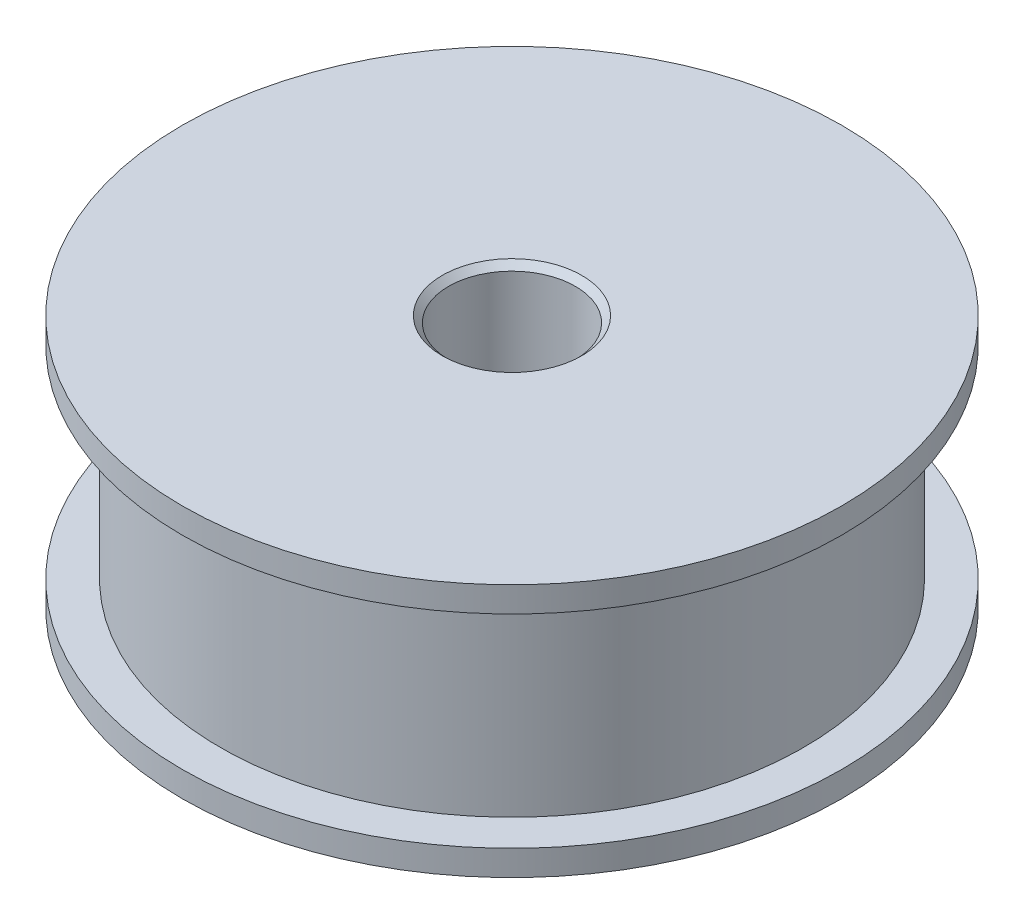
ISO-10303-21;
HEADER;
FILE_DESCRIPTION(('STEP AP214'),'2;1');
FILE_NAME('part.step','',(''),(''),'','','');
FILE_SCHEMA(('AUTOMOTIVE_DESIGN { 1 0 10303 214 1 1 1 1 }'));
ENDSEC;
DATA;
#1=APPLICATION_CONTEXT('core data for automotive mechanical design processes');
#2=APPLICATION_PROTOCOL_DEFINITION('international standard','automotive_design',2000,#1);
#3=PRODUCT_CONTEXT('',#1,'mechanical');
#4=PRODUCT('Part','Part','',(#3));
#5=PRODUCT_RELATED_PRODUCT_CATEGORY('part','',(#4));
#6=PRODUCT_DEFINITION_FORMATION('','',#4);
#7=PRODUCT_DEFINITION_CONTEXT('part definition',#1,'design');
#8=PRODUCT_DEFINITION('design','',#6,#7);
#9=PRODUCT_DEFINITION_SHAPE('','',#8);
#10=(LENGTH_UNIT() NAMED_UNIT(*) SI_UNIT(.MILLI.,.METRE.));
#11=(NAMED_UNIT(*) PLANE_ANGLE_UNIT() SI_UNIT($,.RADIAN.));
#12=(NAMED_UNIT(*) SI_UNIT($,.STERADIAN.) SOLID_ANGLE_UNIT());
#13=UNCERTAINTY_MEASURE_WITH_UNIT(LENGTH_MEASURE(1.E-05),#10,'distance_accuracy_value','');
#14=(GEOMETRIC_REPRESENTATION_CONTEXT(3) GLOBAL_UNCERTAINTY_ASSIGNED_CONTEXT((#13)) GLOBAL_UNIT_ASSIGNED_CONTEXT((#10,
#11,#12)) REPRESENTATION_CONTEXT('',''));
#15=CARTESIAN_POINT('',(0.,0.,0.));
#16=DIRECTION('',(0.,0.,1.));
#17=DIRECTION('',(1.,0.,0.));
#18=AXIS2_PLACEMENT_3D('',#15,#16,#17);
#19=CARTESIAN_POINT('',(0.,20.,0.));
#20=DIRECTION('',(0.,-1.,0.));
#21=DIRECTION('',(0.,0.,-1.));
#22=AXIS2_PLACEMENT_3D('',#19,#20,#21);
#23=CYLINDRICAL_SURFACE('',#22,26.);
#24=CARTESIAN_POINT('',(0.,20.,0.));
#25=DIRECTION('',(0.,1.,0.));
#26=DIRECTION('',(0.,0.,1.));
#27=AXIS2_PLACEMENT_3D('',#24,#25,#26);
#28=CIRCLE('',#27,26.);
#29=CARTESIAN_POINT('',(0.,20.,26.));
#30=VERTEX_POINT('',#29);
#31=EDGE_CURVE('E123',#30,#30,#28,.T.);
#32=ORIENTED_EDGE('',*,*,#31,.F.);
#33=EDGE_LOOP('',(#32));
#34=FACE_BOUND('',#33,.T.);
#35=CARTESIAN_POINT('',(0.,18.,0.));
#36=DIRECTION('',(0.,-1.,0.));
#37=DIRECTION('',(0.,0.,-1.));
#38=AXIS2_PLACEMENT_3D('',#35,#36,#37);
#39=CIRCLE('',#38,26.);
#40=CARTESIAN_POINT('',(0.,18.,-26.));
#41=VERTEX_POINT('',#40);
#42=EDGE_CURVE('E126',#41,#41,#39,.T.);
#43=ORIENTED_EDGE('',*,*,#42,.F.);
#44=EDGE_LOOP('',(#43));
#45=FACE_BOUND('',#44,.T.);
#46=ADVANCED_FACE('F32',(#34,#45),#23,.T.);
#47=CARTESIAN_POINT('',(0.,20.,0.));
#48=DIRECTION('',(0.,1.,0.));
#49=DIRECTION('',(0.,0.,1.));
#50=AXIS2_PLACEMENT_3D('',#47,#48,#49);
#51=PLANE('',#50);
#52=CARTESIAN_POINT('',(0.,20.,0.));
#53=DIRECTION('',(0.,1.,0.));
#54=DIRECTION('',(0.,0.,1.));
#55=AXIS2_PLACEMENT_3D('',#52,#53,#54);
#56=CIRCLE('',#55,5.5);
#57=CARTESIAN_POINT('',(0.,20.,5.5));
#58=VERTEX_POINT('',#57);
#59=EDGE_CURVE('E136',#58,#58,#56,.F.);
#60=ORIENTED_EDGE('',*,*,#59,.T.);
#61=EDGE_LOOP('',(#60));
#62=FACE_BOUND('',#61,.T.);
#63=ORIENTED_EDGE('',*,*,#31,.T.);
#64=EDGE_LOOP('',(#63));
#65=FACE_BOUND('',#64,.T.);
#66=ADVANCED_FACE('F91',(#62,#65),#51,.T.);
#67=CARTESIAN_POINT('',(0.,18.,0.));
#68=DIRECTION('',(0.,-1.,0.));
#69=DIRECTION('',(0.,0.,-1.));
#70=AXIS2_PLACEMENT_3D('',#67,#68,#69);
#71=PLANE('',#70);
#72=CARTESIAN_POINT('',(0.,18.,0.));
#73=DIRECTION('',(0.,-1.,0.));
#74=DIRECTION('',(0.,0.,-1.));
#75=AXIS2_PLACEMENT_3D('',#72,#73,#74);
#76=CIRCLE('',#75,23.);
#77=CARTESIAN_POINT('',(0.,18.,-23.));
#78=VERTEX_POINT('',#77);
#79=EDGE_CURVE('E78',#78,#78,#76,.T.);
#80=ORIENTED_EDGE('',*,*,#79,.F.);
#81=EDGE_LOOP('',(#80));
#82=FACE_BOUND('',#81,.T.);
#83=ORIENTED_EDGE('',*,*,#42,.T.);
#84=EDGE_LOOP('',(#83));
#85=FACE_BOUND('',#84,.T.);
#86=ADVANCED_FACE('F87',(#82,#85),#71,.T.);
#87=CARTESIAN_POINT('',(0.,2.,0.));
#88=DIRECTION('',(0.,-1.,0.));
#89=DIRECTION('',(0.,0.,-1.));
#90=AXIS2_PLACEMENT_3D('',#87,#88,#89);
#91=PLANE('',#90);
#92=CARTESIAN_POINT('',(0.,2.,0.));
#93=DIRECTION('',(0.,-1.,0.));
#94=DIRECTION('',(0.,0.,-1.));
#95=AXIS2_PLACEMENT_3D('',#92,#93,#94);
#96=CIRCLE('',#95,23.);
#97=CARTESIAN_POINT('',(0.,2.,-23.));
#98=VERTEX_POINT('',#97);
#99=EDGE_CURVE('E75',#98,#98,#96,.T.);
#100=ORIENTED_EDGE('',*,*,#99,.T.);
#101=EDGE_LOOP('',(#100));
#102=FACE_BOUND('',#101,.T.);
#103=CARTESIAN_POINT('',(0.,2.,0.));
#104=DIRECTION('',(0.,-1.,0.));
#105=DIRECTION('',(0.,0.,-1.));
#106=AXIS2_PLACEMENT_3D('',#103,#104,#105);
#107=CIRCLE('',#106,26.);
#108=CARTESIAN_POINT('',(0.,2.,-26.));
#109=VERTEX_POINT('',#108);
#110=EDGE_CURVE('E129',#109,#109,#107,.T.);
#111=ORIENTED_EDGE('',*,*,#110,.F.);
#112=EDGE_LOOP('',(#111));
#113=FACE_BOUND('',#112,.T.);
#114=ADVANCED_FACE('F85',(#102,#113),#91,.F.);
#115=CARTESIAN_POINT('',(0.,18.,0.));
#116=DIRECTION('',(0.,-1.,0.));
#117=DIRECTION('',(0.,0.,-1.));
#118=AXIS2_PLACEMENT_3D('',#115,#116,#117);
#119=CYLINDRICAL_SURFACE('',#118,23.);
#120=CARTESIAN_POINT('',(-22.9660074893308,10.,-1.25));
#121=CARTESIAN_POINT('',(-22.9660079453606,9.92984260213779,-1.24999690659648));
#122=CARTESIAN_POINT('',(-22.9663324243369,9.85963565352091,-1.24407368609874));
#123=CARTESIAN_POINT('',(-22.9675954835278,9.72115911093575,-1.22052911955191));
#124=CARTESIAN_POINT('',(-22.9685347844573,9.65289188889691,-1.20289404411814));
#125=CARTESIAN_POINT('',(-22.9709207772096,9.52032077279245,-1.15643270322412));
#126=CARTESIAN_POINT('',(-22.9723672073814,9.45601485498724,-1.12761220801134));
#127=CARTESIAN_POINT('',(-22.9756041458955,9.3331707586771,-1.05960715037706));
#128=CARTESIAN_POINT('',(-22.9773945737778,9.27463123626152,-1.02042501071159));
#129=CARTESIAN_POINT('',(-22.9811201494395,9.16489589355782,-0.932758141494056));
#130=CARTESIAN_POINT('',(-22.9830554440578,9.11370768227925,-0.884263892979946));
#131=CARTESIAN_POINT('',(-22.9868513077095,9.02019297363881,-0.779368649991353));
#132=CARTESIAN_POINT('',(-22.9887118736687,8.97786684053447,-0.722967330671981));
#133=CARTESIAN_POINT('',(-22.992149803825,8.90325595402981,-0.603818028743896));
#134=CARTESIAN_POINT('',(-22.9937269969766,8.87097725676605,-0.541066248442891));
#135=CARTESIAN_POINT('',(-22.9964189488986,8.81741634900081,-0.411024019410908));
#136=CARTESIAN_POINT('',(-22.997533711636,8.79613404416302,-0.343733609621709));
#137=CARTESIAN_POINT('',(-22.9991741919775,8.7651905027374,-0.206595418670422));
#138=CARTESIAN_POINT('',(-22.9997004961332,8.75551769356775,-0.136750255845672));
#139=CARTESIAN_POINT('',(-23.0001067224728,8.74803199671517,0.00357424030690722));
#140=CARTESIAN_POINT('',(-22.9999866504534,8.75021900267433,0.0740535679419363));
#141=CARTESIAN_POINT('',(-22.9991141472226,8.76638127157377,0.213567376171648));
#142=CARTESIAN_POINT('',(-22.9983623840519,8.78034408115449,0.282603304207858));
#143=CARTESIAN_POINT('',(-22.9963119316265,8.81964229290426,0.41734997658801));
#144=CARTESIAN_POINT('',(-22.9950132397736,8.84497774910097,0.483060705133383));
#145=CARTESIAN_POINT('',(-22.9920140475126,8.90631624144904,0.60933175387179));
#146=CARTESIAN_POINT('',(-22.9903133338507,8.94232494184072,0.669889317285532));
#147=CARTESIAN_POINT('',(-22.9867015844678,9.02398363693081,0.784104906644964));
#148=CARTESIAN_POINT('',(-22.9847905469772,9.06963371275882,0.837762874526296));
#149=CARTESIAN_POINT('',(-22.980970399951,9.16934970048167,0.93672876796039));
#150=CARTESIAN_POINT('',(-22.9790612961038,9.22342641821964,0.982025806702068));
#151=CARTESIAN_POINT('',(-22.9754627238249,9.33842272275798,1.06290013491372));
#152=CARTESIAN_POINT('',(-22.97377325546,9.39934231163798,1.09847742142974));
#153=CARTESIAN_POINT('',(-22.9708046690665,9.52630175920577,1.15890144298135));
#154=CARTESIAN_POINT('',(-22.9695255673001,9.5923418206833,1.18374775277411));
#155=CARTESIAN_POINT('',(-22.9675225676117,9.72766454555376,1.22199717511074));
#156=CARTESIAN_POINT('',(-22.9667986647556,9.79694718012432,1.2354003893489));
#157=CARTESIAN_POINT('',(-22.9659886149104,9.93669349471377,1.25036965591079));
#158=CARTESIAN_POINT('',(-22.9659016534157,10.00715555084,1.25195082604034));
#159=CARTESIAN_POINT('',(-22.9663731661879,10.1473439495549,1.24327058785823));
#160=CARTESIAN_POINT('',(-22.9669316379261,10.2170702950249,1.23300922594495));
#161=CARTESIAN_POINT('',(-22.9686303314084,10.353765440421,1.2009477508379));
#162=CARTESIAN_POINT('',(-22.9697702035721,10.4207358712854,1.17915457112368));
#163=CARTESIAN_POINT('',(-22.9725029331748,10.5500684164964,1.12465510739269));
#164=CARTESIAN_POINT('',(-22.9740957937165,10.6124304992749,1.09194874862735));
#165=CARTESIAN_POINT('',(-22.9775569595547,10.7308456345889,1.01651259398106));
#166=CARTESIAN_POINT('',(-22.9794255429724,10.7868922148205,0.973772651212662));
#167=CARTESIAN_POINT('',(-22.9832265808158,10.8910202526659,0.879497364584967));
#168=CARTESIAN_POINT('',(-22.9851590357197,10.9391016506358,0.827961954870319));
#169=CARTESIAN_POINT('',(-22.9888724052319,11.0259853570404,0.717493659996882));
#170=CARTESIAN_POINT('',(-22.9906531590109,11.0647778946488,0.658553083911488));
#171=CARTESIAN_POINT('',(-22.9938601424312,11.1319158866459,0.534986371331544));
#172=CARTESIAN_POINT('',(-22.9952863738243,11.1602613926552,0.470360262932203));
#173=CARTESIAN_POINT('',(-22.9976228177011,11.2056836396831,0.337293193387638));
#174=CARTESIAN_POINT('',(-22.9985333153887,11.2227666098092,0.268854363745749));
#175=CARTESIAN_POINT('',(-22.999736820775,11.2451992569029,0.130074803832834));
#176=CARTESIAN_POINT('',(-23.0000298327934,11.2505490159479,0.0597340868695729));
#177=CARTESIAN_POINT('',(-22.9999653639623,11.2493626028925,-0.0807556483461243));
#178=CARTESIAN_POINT('',(-22.9996087212461,11.2428417453313,-0.150904796827766));
#179=CARTESIAN_POINT('',(-22.9982867340921,11.2181308916567,-0.289110748348517));
#180=CARTESIAN_POINT('',(-22.9973213885299,11.1999408739868,-0.357167547522174));
#181=CARTESIAN_POINT('',(-22.994890569112,11.1524113013111,-0.48925979334759));
#182=CARTESIAN_POINT('',(-22.9934250935967,11.123071709309,-0.553295226654967));
#183=CARTESIAN_POINT('',(-22.9901587383469,11.0540782687811,-0.675532659139827));
#184=CARTESIAN_POINT('',(-22.9883578683921,11.0144247209898,-0.73373482833517));
#185=CARTESIAN_POINT('',(-22.9846206823814,10.9258734054988,-0.842730581287454));
#186=CARTESIAN_POINT('',(-22.9826842091792,10.8769647968725,-0.893515351800763));
#187=CARTESIAN_POINT('',(-22.9788952165331,10.7713019601647,-0.986169913759123));
#188=CARTESIAN_POINT('',(-22.9770427178259,10.7145458080733,-1.02803751253507));
#189=CARTESIAN_POINT('',(-22.9736292020154,10.5947478502463,-1.10169254693167));
#190=CARTESIAN_POINT('',(-22.9720684929555,10.5316995082903,-1.13346935410536));
#191=CARTESIAN_POINT('',(-22.9694193251354,10.4012007726613,-1.18594804801735));
#192=CARTESIAN_POINT('',(-22.9683303103633,10.3337556702281,-1.2066629807425));
#193=CARTESIAN_POINT('',(-22.967034895144,10.2215779755127,-1.23101227835253));
#194=CARTESIAN_POINT('',(-22.9666513243649,10.1775715183028,-1.23812354567172));
#195=CARTESIAN_POINT('',(-22.9661374768474,10.0890500292796,-1.24761838589817));
#196=CARTESIAN_POINT('',(-22.9660071998491,10.0445349979877,-1.25000196365207));
#197=CARTESIAN_POINT('',(-22.9660074893308,10.,-1.25));
#198=B_SPLINE_CURVE_WITH_KNOTS('',3,(#120,#121,#122,#123,#124,#125,#126,#127,#128,#129,#130,
#131,#132,#133,#134,#135,#136,#137,#138,#139,#140,#141,#142,#143,#144,#145,#146,#147,#148,#149,
#150,#151,#152,#153,#154,#155,#156,#157,#158,#159,#160,#161,#162,#163,#164,#165,#166,#167,#168,
#169,#170,#171,#172,#173,#174,#175,#176,#177,#178,#179,#180,#181,#182,#183,#184,#185,#186,#187,
#188,#189,#190,#191,#192,#193,#194,#195,#196,#197),.UNSPECIFIED.,.T.,.F.,(4,2,2,2,2,2,2,2,2,2,2,
2,2,2,2,2,2,2,2,2,2,2,2,2,2,2,2,2,2,2,2,2,2,2,2,2,2,2,4),(0.,0.210309620307611,
0.420866215191582,0.631314333845187,0.841713289035652,1.05232847290504,1.26295231198039,
1.47370286076618,1.68445160152655,1.8949900887061,2.1055266877958,2.3158409152229,
2.5261561417936,2.73658318210961,2.94701199318323,3.15771290106273,3.36841387297679,
3.57912319369837,3.78983064183595,4.00026859512506,4.21070572393285,4.42101647141451,
4.6313286594254,4.84185445780346,5.05238183254567,5.26312969481772,5.4738765157321,
5.68450667833925,5.89513536751978,6.10549251262957,6.31585004633453,6.52620827804694,
6.73656037681859,6.94716041431242,7.15781217722358,7.36868508546785,7.57930874525032,
7.71281067668472,7.84631247125796),.UNSPECIFIED.);
#199=CARTESIAN_POINT('',(-22.9660074893308,10.,-1.25));
#200=VERTEX_POINT('',#199);
#201=EDGE_CURVE('E58',#200,#200,#198,.T.);
#202=ORIENTED_EDGE('',*,*,#201,.F.);
#203=EDGE_LOOP('',(#202));
#204=FACE_BOUND('',#203,.T.);
#205=CARTESIAN_POINT('',(0.,11.25,-23.));
#206=CARTESIAN_POINT('',(0.0701574841489591,11.2499969066748,-22.9999995464798));
#207=CARTESIAN_POINT('',(0.14036451875994,11.2440736721001,-22.9996755589126));
#208=CARTESIAN_POINT('',(0.278841240028029,11.2205290445513,-22.9984142553928));
#209=CARTESIAN_POINT('',(0.347108554823026,11.2028939224852,-22.9974762196496));
#210=CARTESIAN_POINT('',(0.479679867000617,11.1564324451571,-22.9950929726235));
#211=CARTESIAN_POINT('',(0.543985887337104,11.1276118579181,-22.9936480227785));
#212=CARTESIAN_POINT('',(0.666830155204636,11.0596065836167,-22.9904136128434));
#213=CARTESIAN_POINT('',(0.725369746776151,11.0204243195387,-22.9886242333216));
#214=CARTESIAN_POINT('',(0.835105010414245,10.932757325054,-22.984899870737));
#215=CARTESIAN_POINT('',(0.886293095608878,10.8842631034401,-22.9829647403515));
#216=CARTESIAN_POINT('',(0.97980756118481,10.7793679670591,-22.9791682426284));
#217=CARTESIAN_POINT('',(1.02213357692234,10.7229667271048,-22.9773068783285));
#218=CARTESIAN_POINT('',(1.09674434145684,10.6038174937439,-22.9738667342574));
#219=CARTESIAN_POINT('',(1.12902301234937,10.5410656890061,-22.9722881257768));
#220=CARTESIAN_POINT('',(1.18258386460404,10.4110234068369,-22.9695933512824));
#221=CARTESIAN_POINT('',(1.20386614062167,10.343732968479,-22.968477181288));
#222=CARTESIAN_POINT('',(1.2348096206966,10.2065946939993,-22.9668345138149));
#223=CARTESIAN_POINT('',(1.24448239520072,10.1367494757439,-22.9663074292687));
#224=CARTESIAN_POINT('',(1.25196800352087,9.99642487135092,-22.9659006105696));
#225=CARTESIAN_POINT('',(1.24978094406138,9.9259454909257,-22.9660208705914));
#226=CARTESIAN_POINT('',(1.23361859128318,9.78643192085459,-22.9668946339903));
#227=CARTESIAN_POINT('',(1.21965580515618,9.71739627748556,-22.9676474654998));
#228=CARTESIAN_POINT('',(1.18035773931093,9.58265016235849,-22.9697004661491));
#229=CARTESIAN_POINT('',(1.15502240504185,9.5169397065521,-22.9710006379143));
#230=CARTESIAN_POINT('',(1.09368416344329,9.39066898521901,-22.9740025589958));
#231=CARTESIAN_POINT('',(1.05767556314324,9.33011149045237,-22.9757045225233));
#232=CARTESIAN_POINT('',(0.976017080767246,9.21589599577533,-22.9793179911777));
#233=CARTESIAN_POINT('',(0.930367117623371,9.16223805388488,-22.9812294980663));
#234=CARTESIAN_POINT('',(0.830651208817943,9.06327203009183,-22.9850496034949));
#235=CARTESIAN_POINT('',(0.776574434568219,9.0179748578391,-22.9869581950568));
#236=CARTESIAN_POINT('',(0.661577969763035,8.93710028732729,-22.990554978932));
#237=CARTESIAN_POINT('',(0.60065827731693,8.90152289175373,-22.9922431711843));
#238=CARTESIAN_POINT('',(0.473698803858476,8.84109879211702,-22.9952089963558));
#239=CARTESIAN_POINT('',(0.407658836295338,8.81625247924428,-22.9964866143074));
#240=CARTESIAN_POINT('',(0.272336315232593,8.77800302187387,-22.9984870958115));
#241=CARTESIAN_POINT('',(0.203053790397459,8.76459977623868,-22.9992099642671));
#242=CARTESIAN_POINT('',(0.0633075233962715,8.74963039159801,-23.0000188516756));
#243=CARTESIAN_POINT('',(-0.00715459808249182,8.74804916461963,-23.0001056823753));
#244=CARTESIAN_POINT('',(-0.147343141235635,8.75672931243981,-22.9996348652471));
#245=CARTESIAN_POINT('',(-0.217069565791665,8.76699064083487,-22.9990772199444));
#246=CARTESIAN_POINT('',(-0.353765087089874,8.79905212849215,-22.9973807719209));
#247=CARTESIAN_POINT('',(-0.420735806852418,8.82084538786945,-22.9962423167299));
#248=CARTESIAN_POINT('',(-0.550068894520412,8.8753451078977,-22.9935123926938));
#249=CARTESIAN_POINT('',(-0.612431231054715,8.90805164283142,-22.9919209207653));
#250=CARTESIAN_POINT('',(-0.730846533920104,8.98348805373335,-22.9884619056155));
#251=CARTESIAN_POINT('',(-0.786893056508577,9.02622803176853,-22.9865940848609));
#252=CARTESIAN_POINT('',(-0.89102096157748,9.12050335631594,-22.9827936046788));
#253=CARTESIAN_POINT('',(-0.939102284167696,9.17203876895498,-22.9808609447639));
#254=CARTESIAN_POINT('',(-1.02598583528885,9.28250702983649,-22.9771462868055));
#255=CARTESIAN_POINT('',(-1.06477829332785,9.34144756870027,-22.975364448666));
#256=CARTESIAN_POINT('',(-1.13191614555514,9.46501418634015,-22.9721548918586));
#257=CARTESIAN_POINT('',(-1.16026159135892,9.5296402370239,-22.9707271714412));
#258=CARTESIAN_POINT('',(-1.20568379685929,9.66270734918155,-22.9683879965292));
#259=CARTESIAN_POINT('',(-1.22276675962146,9.73114628805607,-22.9674762578852));
#260=CARTESIAN_POINT('',(-1.24519935494727,9.86992607772712,-22.9662710665535));
#261=CARTESIAN_POINT('',(-1.25054907016681,9.94026691512203,-22.9659776095101));
#262=CARTESIAN_POINT('',(-1.24936253251662,10.0807565689938,-22.9660421803842));
#263=CARTESIAN_POINT('',(-1.24284164639967,10.1509055161605,-22.9663993660308));
#264=CARTESIAN_POINT('',(-1.21813080658766,10.2891110581154,-22.9677231856448));
#265=CARTESIAN_POINT('',(-1.19994083097533,10.3571676489734,-22.9686898207569));
#266=CARTESIAN_POINT('',(-1.15241141740243,10.4892594887961,-22.97112340154));
#267=CARTESIAN_POINT('',(-1.1230719426703,10.5532947244974,-22.9725903488609));
#268=CARTESIAN_POINT('',(-1.05407879758938,10.6755318109385,-22.9758591860545));
#269=CARTESIAN_POINT('',(-1.01442542776099,10.7337338315748,-22.9776610661677));
#270=CARTESIAN_POINT('',(-0.925874304386515,10.8427296018331,-22.9813993783095));
#271=CARTESIAN_POINT('',(-0.876965669474564,10.8935145053954,-22.9833359670021));
#272=CARTESIAN_POINT('',(-0.771302725963216,10.9861693234752,-22.9871242361953));
#273=CARTESIAN_POINT('',(-0.714546493642682,11.0280370456667,-22.9889758957282));
#274=CARTESIAN_POINT('',(-0.594748474144662,11.1016922087704,-22.9923871406833));
#275=CARTESIAN_POINT('',(-0.531700165038706,11.1334690445067,-22.993946418122));
#276=CARTESIAN_POINT('',(-0.401201499798104,11.1859478009983,-22.9965927668707));
#277=CARTESIAN_POINT('',(-0.333756434717349,11.2066627672978,-22.9976803941239));
#278=CARTESIAN_POINT('',(-0.221578649753997,11.2310121621726,-22.9989740712893));
#279=CARTESIAN_POINT('',(-0.177572058070253,11.2381234731945,-22.9993570976617));
#280=CARTESIAN_POINT('',(-0.0890502994617616,11.2476183714998,-22.9998702058327));
#281=CARTESIAN_POINT('',(-0.0445351330558323,11.2500019636059,-23.0000002878892));
#282=CARTESIAN_POINT('',(0.,11.25,-23.));
#283=B_SPLINE_CURVE_WITH_KNOTS('',3,(#205,#206,#207,#208,#209,#210,#211,#212,#213,#214,#215,
#216,#217,#218,#219,#220,#221,#222,#223,#224,#225,#226,#227,#228,#229,#230,#231,#232,#233,#234,
#235,#236,#237,#238,#239,#240,#241,#242,#243,#244,#245,#246,#247,#248,#249,#250,#251,#252,#253,
#254,#255,#256,#257,#258,#259,#260,#261,#262,#263,#264,#265,#266,#267,#268,#269,#270,#271,#272,
#273,#274,#275,#276,#277,#278,#279,#280,#281,#282),.UNSPECIFIED.,.T.,.F.,(4,2,2,2,2,2,2,2,2,2,2,
2,2,2,2,2,2,2,2,2,2,2,2,2,2,2,2,2,2,2,2,2,2,2,2,2,2,2,4),(0.,0.21030987945078,0.420866727821662,
0.631315142032036,0.841714388235874,1.05232923309751,1.2629527423354,1.47370341679177,
1.68445227710424,1.89499092264464,2.10552767358922,2.31584109121604,2.52615551766636,
2.73658232537181,2.94701090248965,3.15771214810814,3.36841345194191,3.57912243602345,
3.78982955777188,4.00026771640958,4.21070505047605,4.42101661598779,4.63132961304446,
4.84185527665561,5.05238252313414,5.2631302493966,5.47387693440498,5.68450744875617,
5.89513647929729,6.10549303982835,6.31584999545914,6.52620764486259,6.73655916567091,
6.94715954967004,7.15781165103341,7.36868441340688,7.57930793585165,7.71281027180174,
7.84631247157291),.UNSPECIFIED.);
#284=CARTESIAN_POINT('',(0.,11.25,-23.));
#285=VERTEX_POINT('',#284);
#286=EDGE_CURVE('E57',#285,#285,#283,.T.);
#287=ORIENTED_EDGE('',*,*,#286,.F.);
#288=EDGE_LOOP('',(#287));
#289=FACE_BOUND('',#288,.T.);
#290=ORIENTED_EDGE('',*,*,#79,.T.);
#291=EDGE_LOOP('',(#290));
#292=FACE_BOUND('',#291,.T.);
#293=ORIENTED_EDGE('',*,*,#99,.F.);
#294=EDGE_LOOP('',(#293));
#295=FACE_BOUND('',#294,.T.);
#296=ADVANCED_FACE('F80',(#204,#289,#292,#295),#119,.T.);
#297=CARTESIAN_POINT('',(0.,0.,0.));
#298=DIRECTION('',(0.,1.,0.));
#299=DIRECTION('',(0.,0.,1.));
#300=AXIS2_PLACEMENT_3D('',#297,#298,#299);
#301=PLANE('',#300);
#302=CARTESIAN_POINT('',(0.,0.,0.));
#303=DIRECTION('',(0.,1.,0.));
#304=DIRECTION('',(0.,0.,1.));
#305=AXIS2_PLACEMENT_3D('',#302,#303,#304);
#306=CIRCLE('',#305,5.5);
#307=CARTESIAN_POINT('',(0.,0.,5.5));
#308=VERTEX_POINT('',#307);
#309=EDGE_CURVE('E10',#308,#308,#306,.T.);
#310=ORIENTED_EDGE('',*,*,#309,.T.);
#311=EDGE_LOOP('',(#310));
#312=FACE_BOUND('',#311,.T.);
#313=CARTESIAN_POINT('',(0.,0.,0.));
#314=DIRECTION('',(0.,1.,0.));
#315=DIRECTION('',(0.,0.,1.));
#316=AXIS2_PLACEMENT_3D('',#313,#314,#315);
#317=CIRCLE('',#316,26.);
#318=CARTESIAN_POINT('',(0.,0.,26.));
#319=VERTEX_POINT('',#318);
#320=EDGE_CURVE('E128',#319,#319,#317,.T.);
#321=ORIENTED_EDGE('',*,*,#320,.F.);
#322=EDGE_LOOP('',(#321));
#323=FACE_BOUND('',#322,.T.);
#324=ADVANCED_FACE('F84',(#312,#323),#301,.F.);
#325=ORIENTED_EDGE('',*,*,#110,.T.);
#326=EDGE_LOOP('',(#325));
#327=FACE_BOUND('',#326,.T.);
#328=ORIENTED_EDGE('',*,*,#320,.T.);
#329=EDGE_LOOP('',(#328));
#330=FACE_BOUND('',#329,.T.);
#331=ADVANCED_FACE('F101',(#327,#330),#23,.T.);
#332=CARTESIAN_POINT('',(0.,20.,0.));
#333=DIRECTION('',(0.,-1.,0.));
#334=DIRECTION('',(0.,0.,-1.));
#335=AXIS2_PLACEMENT_3D('',#332,#333,#334);
#336=CYLINDRICAL_SURFACE('',#335,5.);
#337=CARTESIAN_POINT('',(-4.84122918275927,10.,-1.25));
#338=CARTESIAN_POINT('',(-4.84123050042654,9.9309746245377,-1.24999803929589));
#339=CARTESIAN_POINT('',(-4.84272153006957,9.861927550661,-1.24426312274865));
#340=CARTESIAN_POINT('',(-4.84850930996624,9.72581621091298,-1.22151156273207));
#341=CARTESIAN_POINT('',(-4.85280769310907,9.65875312276584,-1.2044883533711));
#342=CARTESIAN_POINT('',(-4.86369362297984,9.52859823090648,-1.15974559981597));
#343=CARTESIAN_POINT('',(-4.87027821345204,9.46550142230716,-1.13203986392723));
#344=CARTESIAN_POINT('',(-4.88499096014404,9.34484457373004,-1.0667605706307));
#345=CARTESIAN_POINT('',(-4.89311918189251,9.28728476895989,-1.02918659428035));
#346=CARTESIAN_POINT('',(-4.91020358177805,9.1780691773689,-0.944354213655937));
#347=CARTESIAN_POINT('',(-4.91917298811515,9.12655319982498,-0.896918443852024));
#348=CARTESIAN_POINT('',(-4.93681437757649,9.03211930281983,-0.794091032050332));
#349=CARTESIAN_POINT('',(-4.94548633283195,8.98920218718913,-0.738698647090153));
#350=CARTESIAN_POINT('',(-4.96170207760291,8.91261226618436,-0.620572600539477));
#351=CARTESIAN_POINT('',(-4.96922843700296,8.87907680591927,-0.557747288097559));
#352=CARTESIAN_POINT('',(-4.98215405962992,8.82309517792346,-0.42713159214638));
#353=CARTESIAN_POINT('',(-4.98755363667172,8.80064737404224,-0.359341942895969));
#354=CARTESIAN_POINT('',(-4.9955237942409,8.76792608271071,-0.22217937937708));
#355=CARTESIAN_POINT('',(-4.99814946922157,8.75741517783671,-0.152866359774487));
#356=CARTESIAN_POINT('',(-5.00046797053649,8.74812081036223,-0.0134144096313845));
#357=CARTESIAN_POINT('',(-5.00016123048352,8.7493356138952,0.0567243972690342));
#358=CARTESIAN_POINT('',(-4.99669047476767,8.76328742512507,0.194190308965484));
#359=CARTESIAN_POINT('',(-4.99359001170437,8.77576816252693,0.261545269501333));
#360=CARTESIAN_POINT('',(-4.98495418262427,8.81148563502425,0.393172809267108));
#361=CARTESIAN_POINT('',(-4.9794186869922,8.83472294268871,0.457445224213047));
#362=CARTESIAN_POINT('',(-4.96643754850448,8.89150128534353,0.581758379377258));
#363=CARTESIAN_POINT('',(-4.95897509847527,8.92513352233087,0.641755637208131));
#364=CARTESIAN_POINT('',(-4.94294951904824,9.00167783955813,0.755344527925611));
#365=CARTESIAN_POINT('',(-4.93438619826245,9.04459153428031,0.808935043856881));
#366=CARTESIAN_POINT('',(-4.9168185688476,9.13985437099119,0.909717543856195));
#367=CARTESIAN_POINT('',(-4.90780859762959,9.19242744617389,0.956697098843999));
#368=CARTESIAN_POINT('',(-4.89057521758353,9.30479998677013,1.04122046995377));
#369=CARTESIAN_POINT('',(-4.88235184552985,9.3645997897455,1.07876384505752));
#370=CARTESIAN_POINT('',(-4.86760248415824,9.49014501707448,1.14348516127825));
#371=CARTESIAN_POINT('',(-4.8610849186286,9.5559178651566,1.17061195871311));
#372=CARTESIAN_POINT('',(-4.85059320069978,9.69129273403823,1.21335702579543));
#373=CARTESIAN_POINT('',(-4.84661850405109,9.76089393199157,1.22897775819114));
#374=CARTESIAN_POINT('',(-4.8417767801957,9.89997975076156,1.24791481933259));
#375=CARTESIAN_POINT('',(-4.84083044546824,9.96941889666481,1.25154523695981));
#376=CARTESIAN_POINT('',(-4.8419367174052,10.1079109682891,1.24725849525777));
#377=CARTESIAN_POINT('',(-4.84398904800633,10.1769639289756,1.2393423989244));
#378=CARTESIAN_POINT('',(-4.8507854097728,10.3115571324774,1.21246273196883));
#379=CARTESIAN_POINT('',(-4.85548485117188,10.3771363632854,1.19368203414087));
#380=CARTESIAN_POINT('',(-4.86700359135481,10.5042157289258,1.14580904083531));
#381=CARTESIAN_POINT('',(-4.87382314124307,10.5657153795277,1.11671552385627));
#382=CARTESIAN_POINT('',(-4.88898068546631,10.6842206389337,1.04838533396828));
#383=CARTESIAN_POINT('',(-4.89734584303321,10.7411144200216,1.00896087691781));
#384=CARTESIAN_POINT('',(-4.91458541535858,10.8475941814007,0.92132536616807));
#385=CARTESIAN_POINT('',(-4.92345991364235,10.897178958325,0.873112868506799));
#386=CARTESIAN_POINT('',(-4.94098701515803,10.9889055212855,0.767828401230907));
#387=CARTESIAN_POINT('',(-4.94962851030918,11.0308300312744,0.710564940664491));
#388=CARTESIAN_POINT('',(-4.96548608306867,11.1044679334756,0.589628353368345));
#389=CARTESIAN_POINT('',(-4.9727022350198,11.1361818583041,0.525955561196989));
#390=CARTESIAN_POINT('',(-4.98485057869157,11.188223017264,0.394447752163863));
#391=CARTESIAN_POINT('',(-4.98979915011205,11.2086321421895,0.326646726284852));
#392=CARTESIAN_POINT('',(-4.99692646697894,11.2377301673042,0.18843720039851));
#393=CARTESIAN_POINT('',(-4.99910574696704,11.2464213293695,0.118029206301555));
#394=CARTESIAN_POINT('',(-5.00042711761014,11.2517094869694,-0.0213544080541574));
#395=CARTESIAN_POINT('',(-4.9996497360001,11.2486271363692,-0.0903172837075409));
#396=CARTESIAN_POINT('',(-4.99532370571779,11.2311902158821,-0.226709370518424));
#397=CARTESIAN_POINT('',(-4.99177513946369,11.2168359812336,-0.294138627226108));
#398=CARTESIAN_POINT('',(-4.98231791067453,11.1774347252863,-0.42521379455602));
#399=CARTESIAN_POINT('',(-4.97642205628333,11.1524456833567,-0.488878118226273));
#400=CARTESIAN_POINT('',(-4.9628911114173,11.0925367762258,-0.611146316301835));
#401=CARTESIAN_POINT('',(-4.9552558017217,11.057615659163,-0.669749551581314));
#402=CARTESIAN_POINT('',(-4.93884062101666,10.9778559575037,-0.781752410529875));
#403=CARTESIAN_POINT('',(-4.93003771182014,10.9327998213658,-0.834993735375731));
#404=CARTESIAN_POINT('',(-4.91238311316552,10.8344714350328,-0.933268775339069));
#405=CARTESIAN_POINT('',(-4.90353141190695,10.7811971048776,-0.978300406335237));
#406=CARTESIAN_POINT('',(-4.88659344825685,10.6667482322483,-1.05970253309904));
#407=CARTESIAN_POINT('',(-4.87852454662356,10.6054448457342,-1.09589577430819));
#408=CARTESIAN_POINT('',(-4.8642994443827,10.4774306375966,-1.15740862076958));
#409=CARTESIAN_POINT('',(-4.85814185308378,10.4107237923666,-1.18273613719965));
#410=CARTESIAN_POINT('',(-4.84939885924729,10.2867787352166,-1.2180281607068));
#411=CARTESIAN_POINT('',(-4.84635828750683,10.2301335445202,-1.22999146324422));
#412=CARTESIAN_POINT('',(-4.84227298231965,10.11566391375,-1.24597786571659));
#413=CARTESIAN_POINT('',(-4.84122807862454,10.0578395746937,-1.25000164296523));
#414=CARTESIAN_POINT('',(-4.84122918275927,10.,-1.25));
#415=B_SPLINE_CURVE_WITH_KNOTS('',3,(#337,#338,#339,#340,#341,#342,#343,#344,#345,#346,#347,
#348,#349,#350,#351,#352,#353,#354,#355,#356,#357,#358,#359,#360,#361,#362,#363,#364,#365,#366,
#367,#368,#369,#370,#371,#372,#373,#374,#375,#376,#377,#378,#379,#380,#381,#382,#383,#384,#385,
#386,#387,#388,#389,#390,#391,#392,#393,#394,#395,#396,#397,#398,#399,#400,#401,#402,#403,#404,
#405,#406,#407,#408,#409,#410,#411,#412,#413,#414),.UNSPECIFIED.,.T.,.F.,(4,2,2,2,2,2,2,2,2,2,2,
2,2,2,2,2,2,2,2,2,2,2,2,2,2,2,2,2,2,2,2,2,2,2,2,2,2,2,4),(0.,0.206863720868069,
0.413847870714333,0.620565363583013,0.827291633777391,1.03811977096488,1.24896760739933,
1.4627574819896,1.67651579923546,1.88594375497673,2.0953407433301,2.30009131344473,
2.50485278362393,2.71146437127222,2.91811192734457,3.13035233285956,3.34260265599901,
3.55588216004201,3.76911600064774,3.97671787380858,4.18430063591901,4.38848702504603,
4.59269760710709,4.80091422929579,5.00916509442522,5.22262665482659,5.43607707859777,
5.64796036403464,5.85980274454519,6.06591723063728,6.2720255868849,6.47702438279855,
6.68204902869036,6.89198548291035,7.10197515782754,7.31588238642338,7.52963360683309,
7.70298913588664,7.8763298754976),.UNSPECIFIED.);
#416=CARTESIAN_POINT('',(-4.84122918275927,10.,-1.25));
#417=VERTEX_POINT('',#416);
#418=EDGE_CURVE('E36',#417,#417,#415,.T.);
#419=ORIENTED_EDGE('',*,*,#418,.T.);
#420=EDGE_LOOP('',(#419));
#421=FACE_BOUND('',#420,.T.);
#422=CARTESIAN_POINT('',(0.,11.25,-5.));
#423=CARTESIAN_POINT('',(0.0690634072247759,11.2499980618849,-4.99999883223344));
#424=CARTESIAN_POINT('',(0.138148464858969,11.2442570410218,-4.99855481776523));
#425=CARTESIAN_POINT('',(0.274338603142111,11.2214790405775,-4.99293428191577));
#426=CARTESIAN_POINT('',(0.341442539058949,11.2044356587185,-4.98875621183307));
#427=CARTESIAN_POINT('',(0.471684060152147,11.1596339554483,-4.97813021943366));
#428=CARTESIAN_POINT('',(0.534826302858335,11.1318885010706,-4.97168502368405));
#429=CARTESIAN_POINT('',(0.655560109920355,11.066515508296,-4.95721119839661));
#430=CARTESIAN_POINT('',(0.713151486957299,11.0288876365676,-4.94918251545042));
#431=CARTESIAN_POINT('',(0.822334939417433,10.9439993419548,-4.93222844659834));
#432=CARTESIAN_POINT('',(0.873796408384227,10.896573687534,-4.92328922623777));
#433=CARTESIAN_POINT('',(0.968124106002754,10.7937898292426,-4.90561350097941));
#434=CARTESIAN_POINT('',(1.01098936412428,10.7384307308779,-4.89687701906957));
#435=CARTESIAN_POINT('',(1.08752211899919,10.6203373110521,-4.88045646416425));
#436=CARTESIAN_POINT('',(1.12104351327113,10.5575056409913,-4.87278995392171));
#437=CARTESIAN_POINT('',(1.17699742379211,10.426876323618,-4.85957912343519));
#438=CARTESIAN_POINT('',(1.19943171286611,10.3590794722285,-4.85403446393991));
#439=CARTESIAN_POINT('',(1.23212903067024,10.2218804181646,-4.84583730597959));
#440=CARTESIAN_POINT('',(1.24262689027778,10.1525375866252,-4.84312909229521));
#441=CARTESIAN_POINT('',(1.25188481255654,10.0130261924883,-4.84074468781451));
#442=CARTESIAN_POINT('',(1.25064678484831,9.94285776608449,-4.8410680037387));
#443=CARTESIAN_POINT('',(1.2366554371994,9.8054868268796,-4.84466004580515));
#444=CARTESIAN_POINT('',(1.22418195015877,9.73825364877908,-4.84785719168233));
#445=CARTESIAN_POINT('',(1.18852015575259,9.60686579090726,-4.85672258063736));
#446=CARTESIAN_POINT('',(1.16533108505785,9.54271133080918,-4.8623909997558));
#447=CARTESIAN_POINT('',(1.10865789828096,9.41855165312328,-4.87562594920155));
#448=CARTESIAN_POINT('',(1.07507222269409,9.35859485684204,-4.88321106224517));
#449=CARTESIAN_POINT('',(0.998630230012462,9.2450677418693,-4.89941425705322));
#450=CARTESIAN_POINT('',(0.955772290674033,9.19149854327729,-4.90803251945613));
#451=CARTESIAN_POINT('',(0.860552853901014,9.090663653588,-4.92563233783151));
#452=CARTESIAN_POINT('',(0.807955215138215,9.04362125828221,-4.93461724564976));
#453=CARTESIAN_POINT('',(0.695509931253082,8.95898229794675,-4.95171637982321));
#454=CARTESIAN_POINT('',(0.635662064756618,8.92138602144703,-4.95983057957846));
#455=CARTESIAN_POINT('',(0.510096573901158,8.85662451147968,-4.97431443411819));
#456=CARTESIAN_POINT('',(0.444359494340518,8.82949554978798,-4.98067800106437));
#457=CARTESIAN_POINT('',(0.309063340119068,8.78673557857536,-4.99089930826182));
#458=CARTESIAN_POINT('',(0.23950499929207,8.77110236965155,-4.99475752782734));
#459=CARTESIAN_POINT('',(0.100449975325022,8.75211869536763,-4.99946249392812));
#460=CARTESIAN_POINT('',(0.0309972666568408,8.74846414493725,-5.00038377923565));
#461=CARTESIAN_POINT('',(-0.107527395667924,8.75270750171291,-4.99932337345376));
#462=CARTESIAN_POINT('',(-0.176599383037163,8.76060436899928,-4.99734194368205));
#463=CARTESIAN_POINT('',(-0.31134522398041,8.78747575699282,-4.99074650939464));
#464=CARTESIAN_POINT('',(-0.377054265807296,8.80628438623082,-4.98617195154843));
#465=CARTESIAN_POINT('',(-0.50438107704376,8.85425590335704,-4.97490588861778));
#466=CARTESIAN_POINT('',(-0.565998432527196,8.88341983692764,-4.9682141697491));
#467=CARTESIAN_POINT('',(-0.684602612024873,8.95186344072894,-4.95327756605259));
#468=CARTESIAN_POINT('',(-0.741487868196526,8.9913134269973,-4.94500722805777));
#469=CARTESIAN_POINT('',(-0.847938844702705,9.07899159066414,-4.92787090989516));
#470=CARTESIAN_POINT('',(-0.897503299144173,9.12722128301409,-4.91900482709754));
#471=CARTESIAN_POINT('',(-0.989158806727275,9.23250163403705,-4.90140797467309));
#472=CARTESIAN_POINT('',(-1.03103655635169,9.28973975250202,-4.89268586822734));
#473=CARTESIAN_POINT('',(-1.10459229917725,9.41061052872143,-4.87660731981032));
#474=CARTESIAN_POINT('',(-1.13627074513161,9.47424290246646,-4.86925081722522));
#475=CARTESIAN_POINT('',(-1.18829285050774,9.60575476867757,-4.85681745612221));
#476=CARTESIAN_POINT('',(-1.20870366387839,9.67360635695334,-4.85172712743255));
#477=CARTESIAN_POINT('',(-1.23778804996148,9.81192469824093,-4.84438953408486));
#478=CARTESIAN_POINT('',(-1.24646418956555,9.88239087586041,-4.84214164766613));
#479=CARTESIAN_POINT('',(-1.25169882527833,10.0217675198793,-4.8407908433663));
#480=CARTESIAN_POINT('',(-1.2485982481501,10.0906645292706,-4.8415994394022));
#481=CARTESIAN_POINT('',(-1.23114773192739,10.2269199072233,-4.84606590839869));
#482=CARTESIAN_POINT('',(-1.21679801890564,10.294278306678,-4.84972372409881));
#483=CARTESIAN_POINT('',(-1.17744276620233,10.4251737158878,-4.85942717235602));
#484=CARTESIAN_POINT('',(-1.15250117056698,10.4887310877002,-4.86545846030258));
#485=CARTESIAN_POINT('',(-1.09272076133756,10.6108044855947,-4.8792312977069));
#486=CARTESIAN_POINT('',(-1.05788057502849,10.6693198109891,-4.88697308433977));
#487=CARTESIAN_POINT('',(-0.97822312386428,10.7812955241683,-4.90354695219593));
#488=CARTESIAN_POINT('',(-0.933169302426878,10.8345842278533,-4.91240220693131));
#489=CARTESIAN_POINT('',(-0.834824475991445,10.9329558706628,-4.93006689371905));
#490=CARTESIAN_POINT('',(-0.78153151771762,10.9780368584275,-4.93887631439216));
#491=CARTESIAN_POINT('',(-0.667056322252157,11.0595094238038,-4.95564713039719));
#492=CARTESIAN_POINT('',(-0.605748685263654,11.0957288447263,-4.9635902780489));
#493=CARTESIAN_POINT('',(-0.477721716258729,11.1572895524504,-4.97754104145932));
#494=CARTESIAN_POINT('',(-0.411006302863949,11.1826386338738,-4.98355004333151));
#495=CARTESIAN_POINT('',(-0.287008544369559,11.2179765252747,-4.99206716304618));
#496=CARTESIAN_POINT('',(-0.230316809090057,11.2299593692112,-4.99502154210575));
#497=CARTESIAN_POINT('',(-0.115755059613569,11.245971619685,-4.9989883769329));
#498=CARTESIAN_POINT('',(-0.0578851343688467,11.2500016244211,-5.00000097875745));
#499=CARTESIAN_POINT('',(0.,11.25,-5.));
#500=B_SPLINE_CURVE_WITH_KNOTS('',3,(#422,#423,#424,#425,#426,#427,#428,#429,#430,#431,#432,
#433,#434,#435,#436,#437,#438,#439,#440,#441,#442,#443,#444,#445,#446,#447,#448,#449,#450,#451,
#452,#453,#454,#455,#456,#457,#458,#459,#460,#461,#462,#463,#464,#465,#466,#467,#468,#469,#470,
#471,#472,#473,#474,#475,#476,#477,#478,#479,#480,#481,#482,#483,#484,#485,#486,#487,#488,#489,
#490,#491,#492,#493,#494,#495,#496,#497,#498,#499),.UNSPECIFIED.,.T.,.F.,(4,2,2,2,2,2,2,2,2,2,2,
2,2,2,2,2,2,2,2,2,2,2,2,2,2,2,2,2,2,2,2,2,2,2,2,2,2,2,4),(0.,0.206978093726575,
0.414073531469916,0.620920751905088,0.827774950141107,1.03845362864283,1.24915607983385,
1.46298872954839,1.6767871764114,1.88630245916192,2.09578365093914,2.30018747505848,
2.50460586221698,2.71108773228232,2.91760575696802,3.13001250807516,3.34242574631872,
3.55556857507595,3.76867061407202,3.97631924124397,4.18394917593952,4.38850228761698,
4.59307606101909,4.80127989637793,5.00951969173349,5.2228709100373,5.4362126562459,
5.6482687884503,5.8602785271034,6.06619816998844,6.27211367463362,6.47680333799539,
6.68152140114084,6.89157980341591,7.10168808142014,7.3156015458299,7.52936136517791,
7.70285202451791,7.87632963369199),.UNSPECIFIED.);
#501=CARTESIAN_POINT('',(0.,11.25,-5.));
#502=VERTEX_POINT('',#501);
#503=EDGE_CURVE('E52',#502,#502,#500,.T.);
#504=ORIENTED_EDGE('',*,*,#503,.T.);
#505=EDGE_LOOP('',(#504));
#506=FACE_BOUND('',#505,.T.);
#507=CARTESIAN_POINT('',(0.,19.5,0.));
#508=DIRECTION('',(0.,1.,0.));
#509=DIRECTION('',(0.,0.,1.));
#510=AXIS2_PLACEMENT_3D('',#507,#508,#509);
#511=CIRCLE('',#510,5.);
#512=CARTESIAN_POINT('',(0.,19.5,5.));
#513=VERTEX_POINT('',#512);
#514=EDGE_CURVE('E44',#513,#513,#511,.T.);
#515=ORIENTED_EDGE('',*,*,#514,.T.);
#516=EDGE_LOOP('',(#515));
#517=FACE_BOUND('',#516,.T.);
#518=CARTESIAN_POINT('',(0.,0.500000000000004,0.));
#519=DIRECTION('',(0.,1.,0.));
#520=DIRECTION('',(0.,0.,1.));
#521=AXIS2_PLACEMENT_3D('',#518,#519,#520);
#522=CIRCLE('',#521,5.);
#523=CARTESIAN_POINT('',(0.,0.500000000000004,5.));
#524=VERTEX_POINT('',#523);
#525=EDGE_CURVE('E49',#524,#524,#522,.F.);
#526=ORIENTED_EDGE('',*,*,#525,.T.);
#527=EDGE_LOOP('',(#526));
#528=FACE_BOUND('',#527,.T.);
#529=ADVANCED_FACE('F59',(#421,#506,#517,#528),#336,.F.);
#530=CARTESIAN_POINT('',(0.,20.,0.));
#531=DIRECTION('',(0.,1.,0.));
#532=DIRECTION('',(0.,0.,1.));
#533=AXIS2_PLACEMENT_3D('',#530,#531,#532);
#534=CONICAL_SURFACE('',#533,5.5,0.78539816339744);
#535=ORIENTED_EDGE('',*,*,#514,.F.);
#536=EDGE_LOOP('',(#535));
#537=FACE_BOUND('',#536,.T.);
#538=ORIENTED_EDGE('',*,*,#59,.F.);
#539=EDGE_LOOP('',(#538));
#540=FACE_BOUND('',#539,.T.);
#541=ADVANCED_FACE('F104',(#537,#540),#534,.F.);
#542=CARTESIAN_POINT('',(0.,0.500000000000004,0.));
#543=DIRECTION('',(0.,-1.,0.));
#544=DIRECTION('',(0.,0.,-1.));
#545=AXIS2_PLACEMENT_3D('',#542,#543,#544);
#546=CONICAL_SURFACE('',#545,5.,0.785398163397443);
#547=ORIENTED_EDGE('',*,*,#309,.F.);
#548=EDGE_LOOP('',(#547));
#549=FACE_BOUND('',#548,.T.);
#550=ORIENTED_EDGE('',*,*,#525,.F.);
#551=EDGE_LOOP('',(#550));
#552=FACE_BOUND('',#551,.T.);
#553=ADVANCED_FACE('F34',(#549,#552),#546,.F.);
#554=CARTESIAN_POINT('',(0.,10.,-26.));
#555=DIRECTION('',(0.,0.,1.));
#556=DIRECTION('',(1.,0.,0.));
#557=AXIS2_PLACEMENT_3D('',#554,#555,#556);
#558=CYLINDRICAL_SURFACE('',#557,1.25);
#559=ORIENTED_EDGE('',*,*,#286,.T.);
#560=EDGE_LOOP('',(#559));
#561=FACE_BOUND('',#560,.T.);
#562=ORIENTED_EDGE('',*,*,#503,.F.);
#563=EDGE_LOOP('',(#562));
#564=FACE_BOUND('',#563,.T.);
#565=ADVANCED_FACE('F62',(#561,#564),#558,.F.);
#566=CARTESIAN_POINT('',(-26.,10.,0.));
#567=DIRECTION('',(1.,0.,0.));
#568=DIRECTION('',(0.,0.,-1.));
#569=AXIS2_PLACEMENT_3D('',#566,#567,#568);
#570=CYLINDRICAL_SURFACE('',#569,1.25);
#571=ORIENTED_EDGE('',*,*,#201,.T.);
#572=EDGE_LOOP('',(#571));
#573=FACE_BOUND('',#572,.T.);
#574=ORIENTED_EDGE('',*,*,#418,.F.);
#575=EDGE_LOOP('',(#574));
#576=FACE_BOUND('',#575,.T.);
#577=ADVANCED_FACE('F65',(#573,#576),#570,.F.);
#578=CLOSED_SHELL('',(#46,#66,#86,#114,#296,#324,#331,#529,#541,#553,#565,#577));
#579=MANIFOLD_SOLID_BREP('B2',#578);
#580=ADVANCED_BREP_SHAPE_REPRESENTATION('',(#18,#579),#14);
#581=SHAPE_DEFINITION_REPRESENTATION(#9,#580);
ENDSEC;
END-ISO-10303-21;
